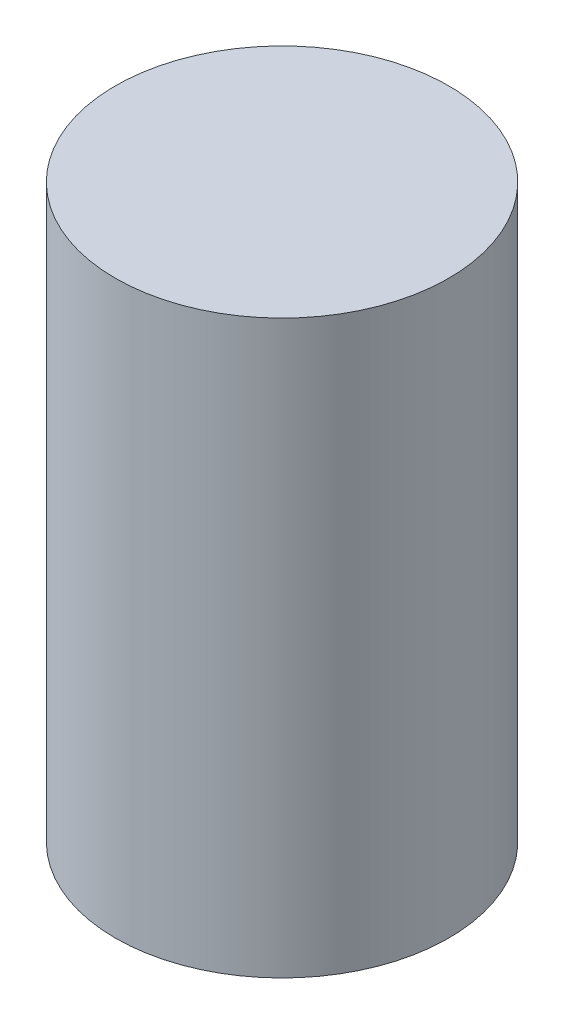
ISO-10303-21;
HEADER;
FILE_DESCRIPTION(('STEP AP214'),'2;1');
FILE_NAME('part.step','',(''),(''),'','','');
FILE_SCHEMA(('AUTOMOTIVE_DESIGN { 1 0 10303 214 1 1 1 1 }'));
ENDSEC;
DATA;
#1=APPLICATION_CONTEXT('core data for automotive mechanical design processes');
#2=APPLICATION_PROTOCOL_DEFINITION('international standard','automotive_design',2000,#1);
#3=PRODUCT_CONTEXT('',#1,'mechanical');
#4=PRODUCT('Part','Part','',(#3));
#5=PRODUCT_RELATED_PRODUCT_CATEGORY('part','',(#4));
#6=PRODUCT_DEFINITION_FORMATION('','',#4);
#7=PRODUCT_DEFINITION_CONTEXT('part definition',#1,'design');
#8=PRODUCT_DEFINITION('design','',#6,#7);
#9=PRODUCT_DEFINITION_SHAPE('','',#8);
#10=(LENGTH_UNIT() NAMED_UNIT(*) SI_UNIT(.MILLI.,.METRE.));
#11=(NAMED_UNIT(*) PLANE_ANGLE_UNIT() SI_UNIT($,.RADIAN.));
#12=(NAMED_UNIT(*) SI_UNIT($,.STERADIAN.) SOLID_ANGLE_UNIT());
#13=UNCERTAINTY_MEASURE_WITH_UNIT(LENGTH_MEASURE(1.E-05),#10,'distance_accuracy_value','');
#14=(GEOMETRIC_REPRESENTATION_CONTEXT(3) GLOBAL_UNCERTAINTY_ASSIGNED_CONTEXT((#13)) GLOBAL_UNIT_ASSIGNED_CONTEXT((#10,
#11,#12)) REPRESENTATION_CONTEXT('',''));
#15=CARTESIAN_POINT('',(0.,0.,0.));
#16=DIRECTION('',(0.,0.,1.));
#17=DIRECTION('',(1.,0.,0.));
#18=AXIS2_PLACEMENT_3D('',#15,#16,#17);
#19=CARTESIAN_POINT('',(0.,-1.5,0.));
#20=DIRECTION('',(0.,-1.,0.));
#21=DIRECTION('',(0.,0.,-1.));
#22=AXIS2_PLACEMENT_3D('',#19,#20,#21);
#23=PLANE('',#22);
#24=CARTESIAN_POINT('',(0.,-1.5,0.));
#25=DIRECTION('',(0.,1.,0.));
#26=DIRECTION('',(0.,0.,1.));
#27=AXIS2_PLACEMENT_3D('',#24,#25,#26);
#28=CIRCLE('',#27,2.5);
#29=CARTESIAN_POINT('',(0.,-1.5,2.5));
#30=VERTEX_POINT('',#29);
#31=EDGE_CURVE('E17',#30,#30,#28,.T.);
#32=ORIENTED_EDGE('',*,*,#31,.F.);
#33=EDGE_LOOP('',(#32));
#34=FACE_BOUND('',#33,.T.);
#35=ADVANCED_FACE('F14',(#34),#23,.T.);
#36=CARTESIAN_POINT('',(0.,0.,0.));
#37=DIRECTION('',(0.,1.,0.));
#38=DIRECTION('',(0.,0.,1.));
#39=AXIS2_PLACEMENT_3D('',#36,#37,#38);
#40=CYLINDRICAL_SURFACE('',#39,2.5);
#41=ORIENTED_EDGE('',*,*,#31,.T.);
#42=EDGE_LOOP('',(#41));
#43=FACE_BOUND('',#42,.T.);
#44=CARTESIAN_POINT('',(0.,0.,0.));
#45=DIRECTION('',(0.,1.,0.));
#46=DIRECTION('',(0.,0.,1.));
#47=AXIS2_PLACEMENT_3D('',#44,#45,#46);
#48=CIRCLE('',#47,2.5);
#49=CARTESIAN_POINT('',(0.,0.,2.5));
#50=VERTEX_POINT('',#49);
#51=EDGE_CURVE('E26',#50,#50,#48,.T.);
#52=ORIENTED_EDGE('',*,*,#51,.F.);
#53=EDGE_LOOP('',(#52));
#54=FACE_BOUND('',#53,.T.);
#55=ADVANCED_FACE('F34',(#43,#54),#40,.T.);
#56=CARTESIAN_POINT('',(-2.5,0.,0.));
#57=DIRECTION('',(0.,-1.,0.));
#58=DIRECTION('',(0.,0.,-1.));
#59=AXIS2_PLACEMENT_3D('',#56,#57,#58);
#60=PLANE('',#59);
#61=CARTESIAN_POINT('',(0.,0.,0.));
#62=DIRECTION('',(0.,1.,0.));
#63=DIRECTION('',(0.,0.,1.));
#64=AXIS2_PLACEMENT_3D('',#61,#62,#63);
#65=CIRCLE('',#64,6.3);
#66=CARTESIAN_POINT('',(0.,0.,6.3));
#67=VERTEX_POINT('',#66);
#68=EDGE_CURVE('E21',#67,#67,#65,.T.);
#69=ORIENTED_EDGE('',*,*,#68,.F.);
#70=EDGE_LOOP('',(#69));
#71=FACE_BOUND('',#70,.T.);
#72=ORIENTED_EDGE('',*,*,#51,.T.);
#73=EDGE_LOOP('',(#72));
#74=FACE_BOUND('',#73,.T.);
#75=ADVANCED_FACE('F42',(#71,#74),#60,.T.);
#76=CARTESIAN_POINT('',(0.,21.6,0.));
#77=DIRECTION('',(0.,1.,0.));
#78=DIRECTION('',(0.,0.,1.));
#79=AXIS2_PLACEMENT_3D('',#76,#77,#78);
#80=PLANE('',#79);
#81=CARTESIAN_POINT('',(0.,21.6,0.));
#82=DIRECTION('',(0.,1.,0.));
#83=DIRECTION('',(0.,0.,1.));
#84=AXIS2_PLACEMENT_3D('',#81,#82,#83);
#85=CIRCLE('',#84,6.3);
#86=CARTESIAN_POINT('',(0.,21.6,6.3));
#87=VERTEX_POINT('',#86);
#88=EDGE_CURVE('E10',#87,#87,#85,.F.);
#89=ORIENTED_EDGE('',*,*,#88,.F.);
#90=EDGE_LOOP('',(#89));
#91=FACE_BOUND('',#90,.T.);
#92=ADVANCED_FACE('F45',(#91),#80,.T.);
#93=CARTESIAN_POINT('',(0.,0.,0.));
#94=DIRECTION('',(0.,1.,0.));
#95=DIRECTION('',(0.,0.,1.));
#96=AXIS2_PLACEMENT_3D('',#93,#94,#95);
#97=CYLINDRICAL_SURFACE('',#96,6.3);
#98=ORIENTED_EDGE('',*,*,#88,.T.);
#99=EDGE_LOOP('',(#98));
#100=FACE_BOUND('',#99,.T.);
#101=ORIENTED_EDGE('',*,*,#68,.T.);
#102=EDGE_LOOP('',(#101));
#103=FACE_BOUND('',#102,.T.);
#104=ADVANCED_FACE('F43',(#100,#103),#97,.T.);
#105=CLOSED_SHELL('',(#35,#55,#75,#92,#104));
#106=MANIFOLD_SOLID_BREP('B1',#105);
#107=ADVANCED_BREP_SHAPE_REPRESENTATION('',(#18,#106),#14);
#108=SHAPE_DEFINITION_REPRESENTATION(#9,#107);
ENDSEC;
END-ISO-10303-21;
